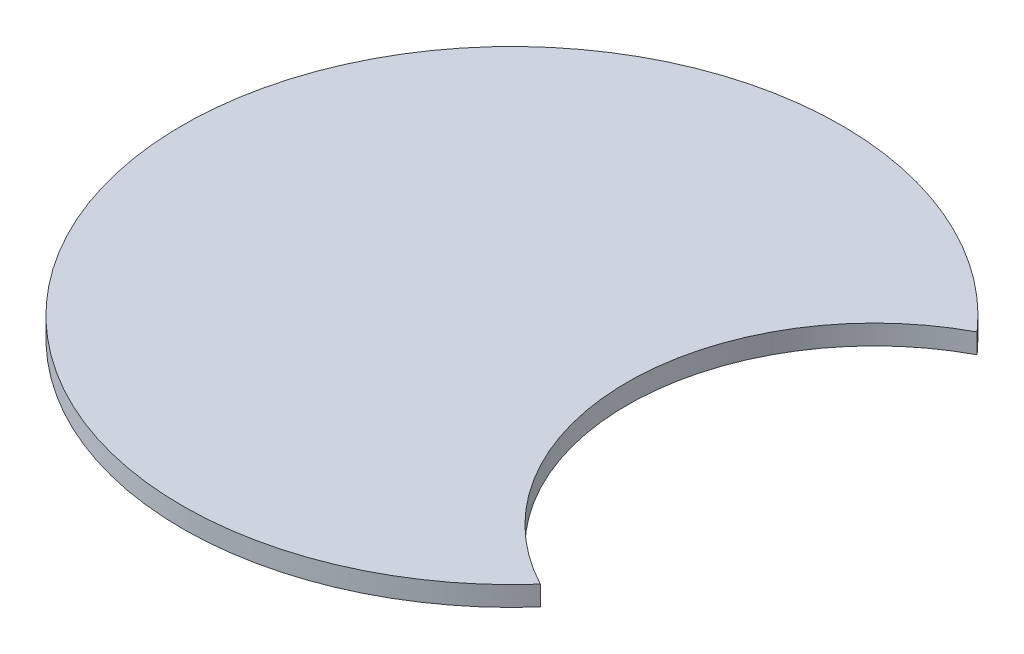
ISO-10303-21;
HEADER;
FILE_DESCRIPTION(('STEP AP214'),'2;1');
FILE_NAME('part.step','',(''),(''),'','','');
FILE_SCHEMA(('AUTOMOTIVE_DESIGN { 1 0 10303 214 1 1 1 1 }'));
ENDSEC;
DATA;
#1=APPLICATION_CONTEXT('core data for automotive mechanical design processes');
#2=APPLICATION_PROTOCOL_DEFINITION('international standard','automotive_design',2000,#1);
#3=PRODUCT_CONTEXT('',#1,'mechanical');
#4=PRODUCT('Part','Part','',(#3));
#5=PRODUCT_RELATED_PRODUCT_CATEGORY('part','',(#4));
#6=PRODUCT_DEFINITION_FORMATION('','',#4);
#7=PRODUCT_DEFINITION_CONTEXT('part definition',#1,'design');
#8=PRODUCT_DEFINITION('design','',#6,#7);
#9=PRODUCT_DEFINITION_SHAPE('','',#8);
#10=(LENGTH_UNIT() NAMED_UNIT(*) SI_UNIT(.MILLI.,.METRE.));
#11=(NAMED_UNIT(*) PLANE_ANGLE_UNIT() SI_UNIT($,.RADIAN.));
#12=(NAMED_UNIT(*) SI_UNIT($,.STERADIAN.) SOLID_ANGLE_UNIT());
#13=UNCERTAINTY_MEASURE_WITH_UNIT(LENGTH_MEASURE(1.E-05),#10,'distance_accuracy_value','');
#14=(GEOMETRIC_REPRESENTATION_CONTEXT(3) GLOBAL_UNCERTAINTY_ASSIGNED_CONTEXT((#13)) GLOBAL_UNIT_ASSIGNED_CONTEXT((#10,
#11,#12)) REPRESENTATION_CONTEXT('',''));
#15=CARTESIAN_POINT('',(0.,0.,0.));
#16=DIRECTION('',(0.,0.,1.));
#17=DIRECTION('',(1.,0.,0.));
#18=AXIS2_PLACEMENT_3D('',#15,#16,#17);
#19=CARTESIAN_POINT('',(55.,3.,0.));
#20=DIRECTION('',(0.,-1.,0.));
#21=DIRECTION('',(0.,0.,-1.));
#22=AXIS2_PLACEMENT_3D('',#19,#20,#21);
#23=CYLINDRICAL_SURFACE('',#22,37.5);
#24=CARTESIAN_POINT('',(55.,0.,0.));
#25=DIRECTION('',(0.,-1.,0.));
#26=DIRECTION('',(0.,0.,1.));
#27=AXIS2_PLACEMENT_3D('',#24,#25,#26);
#28=CIRCLE('',#27,37.5);
#29=CARTESIAN_POINT('',(37.4431818181818,0.,33.136205807705));
#30=VERTEX_POINT('',#29);
#31=CARTESIAN_POINT('',(37.4431818181818,0.,-33.136205807705));
#32=VERTEX_POINT('',#31);
#33=EDGE_CURVE('E72',#30,#32,#28,.T.);
#34=ORIENTED_EDGE('',*,*,#33,.T.);
#35=DIRECTION('',(0.,-1.,0.));
#36=VECTOR('',#35,1.);
#37=CARTESIAN_POINT('',(37.4431818181818,3.,-33.136205807705));
#38=LINE('',#37,#36);
#39=CARTESIAN_POINT('',(37.4431818181818,3.,-33.136205807705));
#40=VERTEX_POINT('',#39);
#41=EDGE_CURVE('E11',#40,#32,#38,.T.);
#42=ORIENTED_EDGE('',*,*,#41,.F.);
#43=CARTESIAN_POINT('',(55.,3.,0.));
#44=DIRECTION('',(0.,-1.,0.));
#45=DIRECTION('',(0.,0.,1.));
#46=AXIS2_PLACEMENT_3D('',#43,#44,#45);
#47=CIRCLE('',#46,37.5);
#48=CARTESIAN_POINT('',(37.4431818181818,3.,33.136205807705));
#49=VERTEX_POINT('',#48);
#50=EDGE_CURVE('E71',#49,#40,#47,.T.);
#51=ORIENTED_EDGE('',*,*,#50,.F.);
#52=DIRECTION('',(0.,-1.,0.));
#53=VECTOR('',#52,1.);
#54=CARTESIAN_POINT('',(37.4431818181818,3.,33.136205807705));
#55=LINE('',#54,#53);
#56=EDGE_CURVE('E48',#49,#30,#55,.T.);
#57=ORIENTED_EDGE('',*,*,#56,.T.);
#58=EDGE_LOOP('',(#34,#42,#51,#57));
#59=FACE_BOUND('',#58,.T.);
#60=ADVANCED_FACE('F39',(#59),#23,.F.);
#61=CARTESIAN_POINT('',(0.,3.,0.));
#62=DIRECTION('',(0.,-1.,0.));
#63=DIRECTION('',(0.,0.,-1.));
#64=AXIS2_PLACEMENT_3D('',#61,#62,#63);
#65=CYLINDRICAL_SURFACE('',#64,50.);
#66=CARTESIAN_POINT('',(0.,0.,0.));
#67=DIRECTION('',(0.,1.,0.));
#68=DIRECTION('',(0.,0.,1.));
#69=AXIS2_PLACEMENT_3D('',#66,#67,#68);
#70=CIRCLE('',#69,50.);
#71=EDGE_CURVE('E63',#32,#30,#70,.T.);
#72=ORIENTED_EDGE('',*,*,#71,.T.);
#73=ORIENTED_EDGE('',*,*,#56,.F.);
#74=CARTESIAN_POINT('',(0.,3.,0.));
#75=DIRECTION('',(0.,1.,0.));
#76=DIRECTION('',(0.,0.,1.));
#77=AXIS2_PLACEMENT_3D('',#74,#75,#76);
#78=CIRCLE('',#77,50.);
#79=EDGE_CURVE('E55',#40,#49,#78,.T.);
#80=ORIENTED_EDGE('',*,*,#79,.F.);
#81=ORIENTED_EDGE('',*,*,#41,.T.);
#82=EDGE_LOOP('',(#72,#73,#80,#81));
#83=FACE_BOUND('',#82,.T.);
#84=ADVANCED_FACE('F66',(#83),#65,.T.);
#85=CARTESIAN_POINT('',(27.5,3.,0.));
#86=DIRECTION('',(0.,1.,0.));
#87=DIRECTION('',(0.,0.,1.));
#88=AXIS2_PLACEMENT_3D('',#85,#86,#87);
#89=PLANE('',#88);
#90=ORIENTED_EDGE('',*,*,#50,.T.);
#91=ORIENTED_EDGE('',*,*,#79,.T.);
#92=EDGE_LOOP('',(#90,#91));
#93=FACE_BOUND('',#92,.T.);
#94=ADVANCED_FACE('F83',(#93),#89,.T.);
#95=CARTESIAN_POINT('',(27.5,0.,0.));
#96=DIRECTION('',(0.,1.,0.));
#97=DIRECTION('',(0.,0.,1.));
#98=AXIS2_PLACEMENT_3D('',#95,#96,#97);
#99=PLANE('',#98);
#100=ORIENTED_EDGE('',*,*,#33,.F.);
#101=ORIENTED_EDGE('',*,*,#71,.F.);
#102=EDGE_LOOP('',(#100,#101));
#103=FACE_BOUND('',#102,.T.);
#104=ADVANCED_FACE('F76',(#103),#99,.F.);
#105=CLOSED_SHELL('',(#60,#84,#94,#104));
#106=MANIFOLD_SOLID_BREP('B2',#105);
#107=ADVANCED_BREP_SHAPE_REPRESENTATION('',(#18,#106),#14);
#108=SHAPE_DEFINITION_REPRESENTATION(#9,#107);
ENDSEC;
END-ISO-10303-21;
